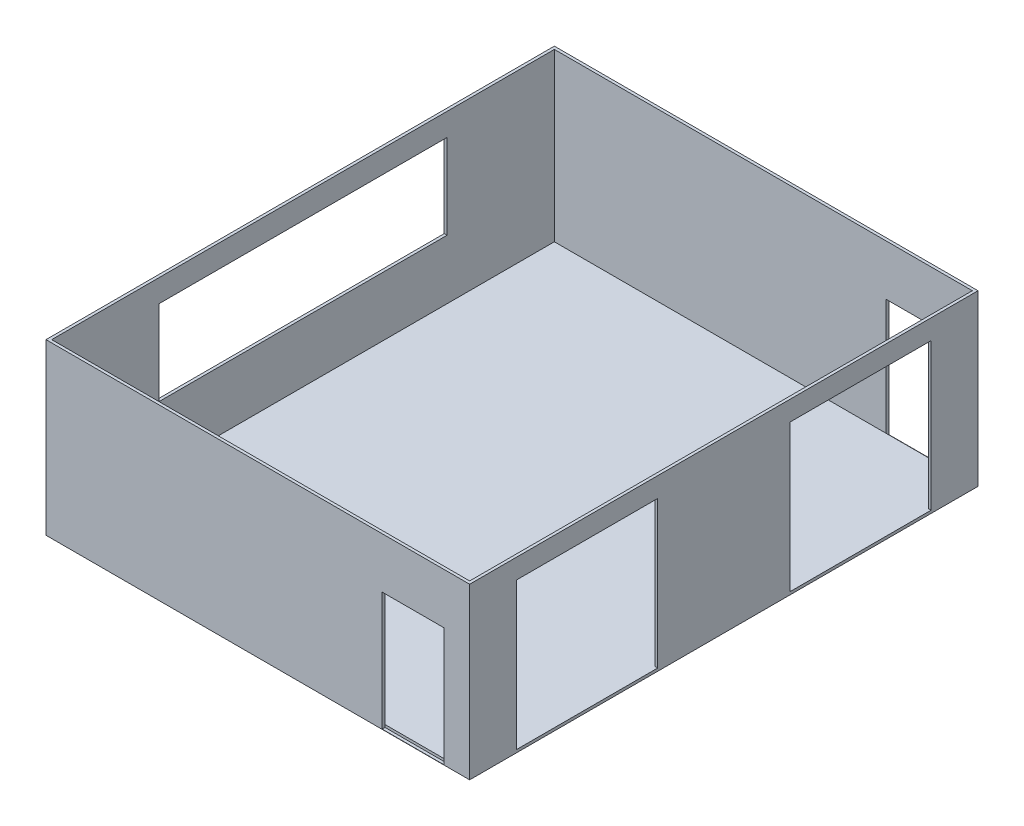
ISO-10303-21;
HEADER;
FILE_DESCRIPTION(('STEP AP214'),'2;1');
FILE_NAME('part.step','',(''),(''),'','','');
FILE_SCHEMA(('AUTOMOTIVE_DESIGN { 1 0 10303 214 1 1 1 1 }'));
ENDSEC;
DATA;
#1=APPLICATION_CONTEXT('core data for automotive mechanical design processes');
#2=APPLICATION_PROTOCOL_DEFINITION('international standard','automotive_design',2000,#1);
#3=PRODUCT_CONTEXT('',#1,'mechanical');
#4=PRODUCT('Part','Part','',(#3));
#5=PRODUCT_RELATED_PRODUCT_CATEGORY('part','',(#4));
#6=PRODUCT_DEFINITION_FORMATION('','',#4);
#7=PRODUCT_DEFINITION_CONTEXT('part definition',#1,'design');
#8=PRODUCT_DEFINITION('design','',#6,#7);
#9=PRODUCT_DEFINITION_SHAPE('','',#8);
#10=(LENGTH_UNIT() NAMED_UNIT(*) SI_UNIT(.MILLI.,.METRE.));
#11=(NAMED_UNIT(*) PLANE_ANGLE_UNIT() SI_UNIT($,.RADIAN.));
#12=(NAMED_UNIT(*) SI_UNIT($,.STERADIAN.) SOLID_ANGLE_UNIT());
#13=UNCERTAINTY_MEASURE_WITH_UNIT(LENGTH_MEASURE(1.E-05),#10,'distance_accuracy_value','');
#14=(GEOMETRIC_REPRESENTATION_CONTEXT(3) GLOBAL_UNCERTAINTY_ASSIGNED_CONTEXT((#13)) GLOBAL_UNIT_ASSIGNED_CONTEXT((#10,
#11,#12)) REPRESENTATION_CONTEXT('',''));
#15=CARTESIAN_POINT('',(0.,0.,0.));
#16=DIRECTION('',(0.,0.,1.));
#17=DIRECTION('',(1.,0.,0.));
#18=AXIS2_PLACEMENT_3D('',#15,#16,#17);
#19=CARTESIAN_POINT('',(-3750.,3000.,4500.));
#20=DIRECTION('',(1.,0.,0.));
#21=DIRECTION('',(0.,0.,-1.));
#22=AXIS2_PLACEMENT_3D('',#19,#20,#21);
#23=PLANE('',#22);
#24=DIRECTION('',(0.,0.,1.));
#25=VECTOR('',#24,1.);
#26=CARTESIAN_POINT('',(-3750.,0.,4500.));
#27=LINE('',#26,#25);
#28=CARTESIAN_POINT('',(-3750.,0.,-4500.));
#29=VERTEX_POINT('',#28);
#30=CARTESIAN_POINT('',(-3750.,0.,4500.));
#31=VERTEX_POINT('',#30);
#32=EDGE_CURVE('E389',#29,#31,#27,.T.);
#33=ORIENTED_EDGE('',*,*,#32,.T.);
#34=DIRECTION('',(0.,-1.,0.));
#35=VECTOR('',#34,1.);
#36=CARTESIAN_POINT('',(-3750.,3000.,4500.));
#37=LINE('',#36,#35);
#38=CARTESIAN_POINT('',(-3750.,3000.,4500.));
#39=VERTEX_POINT('',#38);
#40=EDGE_CURVE('E39',#39,#31,#37,.T.);
#41=ORIENTED_EDGE('',*,*,#40,.F.);
#42=DIRECTION('',(0.,0.,1.));
#43=VECTOR('',#42,1.);
#44=CARTESIAN_POINT('',(-3750.,3000.,4500.));
#45=LINE('',#44,#43);
#46=CARTESIAN_POINT('',(-3750.,3000.,-4500.));
#47=VERTEX_POINT('',#46);
#48=EDGE_CURVE('E422',#47,#39,#45,.T.);
#49=ORIENTED_EDGE('',*,*,#48,.F.);
#50=DIRECTION('',(0.,-1.,0.));
#51=VECTOR('',#50,1.);
#52=CARTESIAN_POINT('',(-3750.,3000.,-4500.));
#53=LINE('',#52,#51);
#54=EDGE_CURVE('E432',#47,#29,#53,.T.);
#55=ORIENTED_EDGE('',*,*,#54,.T.);
#56=EDGE_LOOP('',(#33,#41,#49,#55));
#57=FACE_BOUND('',#56,.T.);
#58=DIRECTION('',(0.,-1.,0.));
#59=VECTOR('',#58,1.);
#60=CARTESIAN_POINT('',(-3750.,0.,2550.));
#61=LINE('',#60,#59);
#62=CARTESIAN_POINT('',(-3750.,2600.,2550.));
#63=VERTEX_POINT('',#62);
#64=CARTESIAN_POINT('',(-3750.,1100.,2550.));
#65=VERTEX_POINT('',#64);
#66=EDGE_CURVE('E46',#63,#65,#61,.T.);
#67=ORIENTED_EDGE('',*,*,#66,.T.);
#68=DIRECTION('',(0.,0.,1.));
#69=VECTOR('',#68,1.);
#70=CARTESIAN_POINT('',(-3750.,1100.,0.));
#71=LINE('',#70,#69);
#72=CARTESIAN_POINT('',(-3750.,1100.,-2550.));
#73=VERTEX_POINT('',#72);
#74=EDGE_CURVE('E244',#73,#65,#71,.T.);
#75=ORIENTED_EDGE('',*,*,#74,.F.);
#76=DIRECTION('',(0.,-1.,0.));
#77=VECTOR('',#76,1.);
#78=CARTESIAN_POINT('',(-3750.,0.,-2550.));
#79=LINE('',#78,#77);
#80=CARTESIAN_POINT('',(-3750.,2600.,-2550.));
#81=VERTEX_POINT('',#80);
#82=EDGE_CURVE('E247',#81,#73,#79,.T.);
#83=ORIENTED_EDGE('',*,*,#82,.F.);
#84=DIRECTION('',(0.,0.,1.));
#85=VECTOR('',#84,1.);
#86=CARTESIAN_POINT('',(-3750.,2600.,0.));
#87=LINE('',#86,#85);
#88=EDGE_CURVE('E253',#81,#63,#87,.T.);
#89=ORIENTED_EDGE('',*,*,#88,.T.);
#90=EDGE_LOOP('',(#67,#75,#83,#89));
#91=FACE_BOUND('',#90,.T.);
#92=ADVANCED_FACE('F32',(#57,#91),#23,.F.);
#93=CARTESIAN_POINT('',(-3700.,3000.,4500.));
#94=DIRECTION('',(1.,0.,0.));
#95=DIRECTION('',(0.,0.,-1.));
#96=AXIS2_PLACEMENT_3D('',#93,#94,#95);
#97=PLANE('',#96);
#98=DIRECTION('',(0.,0.,1.));
#99=VECTOR('',#98,1.);
#100=CARTESIAN_POINT('',(-3700.,49.9999999999998,4500.));
#101=LINE('',#100,#99);
#102=CARTESIAN_POINT('',(-3700.,50.,-4450.));
#103=VERTEX_POINT('',#102);
#104=CARTESIAN_POINT('',(-3700.,50.,4450.));
#105=VERTEX_POINT('',#104);
#106=EDGE_CURVE('E382',#103,#105,#101,.T.);
#107=ORIENTED_EDGE('',*,*,#106,.F.);
#108=DIRECTION('',(0.,-1.,0.));
#109=VECTOR('',#108,1.);
#110=CARTESIAN_POINT('',(-3700.,3000.,-4450.));
#111=LINE('',#110,#109);
#112=CARTESIAN_POINT('',(-3700.,3000.,-4450.));
#113=VERTEX_POINT('',#112);
#114=EDGE_CURVE('E391',#113,#103,#111,.T.);
#115=ORIENTED_EDGE('',*,*,#114,.F.);
#116=DIRECTION('',(0.,0.,1.));
#117=VECTOR('',#116,1.);
#118=CARTESIAN_POINT('',(-3700.,3000.,4500.));
#119=LINE('',#118,#117);
#120=CARTESIAN_POINT('',(-3700.,3000.,4450.));
#121=VERTEX_POINT('',#120);
#122=EDGE_CURVE('E413',#113,#121,#119,.T.);
#123=ORIENTED_EDGE('',*,*,#122,.T.);
#124=DIRECTION('',(0.,-1.,0.));
#125=VECTOR('',#124,1.);
#126=CARTESIAN_POINT('',(-3700.,3000.,4450.));
#127=LINE('',#126,#125);
#128=EDGE_CURVE('E386',#121,#105,#127,.T.);
#129=ORIENTED_EDGE('',*,*,#128,.T.);
#130=EDGE_LOOP('',(#107,#115,#123,#129));
#131=FACE_BOUND('',#130,.T.);
#132=DIRECTION('',(0.,0.,1.));
#133=VECTOR('',#132,1.);
#134=CARTESIAN_POINT('',(-3700.,1100.,0.));
#135=LINE('',#134,#133);
#136=CARTESIAN_POINT('',(-3700.,1100.,-2550.));
#137=VERTEX_POINT('',#136);
#138=CARTESIAN_POINT('',(-3700.,1100.,2550.));
#139=VERTEX_POINT('',#138);
#140=EDGE_CURVE('E239',#137,#139,#135,.T.);
#141=ORIENTED_EDGE('',*,*,#140,.T.);
#142=DIRECTION('',(0.,-1.,0.));
#143=VECTOR('',#142,1.);
#144=CARTESIAN_POINT('',(-3700.,0.,2550.));
#145=LINE('',#144,#143);
#146=CARTESIAN_POINT('',(-3700.,2600.,2550.));
#147=VERTEX_POINT('',#146);
#148=EDGE_CURVE('E235',#147,#139,#145,.T.);
#149=ORIENTED_EDGE('',*,*,#148,.F.);
#150=DIRECTION('',(0.,0.,1.));
#151=VECTOR('',#150,1.);
#152=CARTESIAN_POINT('',(-3700.,2600.,0.));
#153=LINE('',#152,#151);
#154=CARTESIAN_POINT('',(-3700.,2600.,-2550.));
#155=VERTEX_POINT('',#154);
#156=EDGE_CURVE('E227',#155,#147,#153,.T.);
#157=ORIENTED_EDGE('',*,*,#156,.F.);
#158=DIRECTION('',(0.,-1.,0.));
#159=VECTOR('',#158,1.);
#160=CARTESIAN_POINT('',(-3700.,0.,-2550.));
#161=LINE('',#160,#159);
#162=EDGE_CURVE('E54',#155,#137,#161,.T.);
#163=ORIENTED_EDGE('',*,*,#162,.T.);
#164=EDGE_LOOP('',(#141,#149,#157,#163));
#165=FACE_BOUND('',#164,.T.);
#166=ADVANCED_FACE('F242',(#131,#165),#97,.T.);
#167=CARTESIAN_POINT('',(3750.,3000.,4500.));
#168=DIRECTION('',(0.,0.,-1.));
#169=DIRECTION('',(-1.,0.,0.));
#170=AXIS2_PLACEMENT_3D('',#167,#168,#169);
#171=PLANE('',#170);
#172=DIRECTION('',(-1.,0.,0.));
#173=VECTOR('',#172,1.);
#174=CARTESIAN_POINT('',(3300.,2105.,4500.));
#175=LINE('',#174,#173);
#176=CARTESIAN_POINT('',(3300.,2105.,4500.));
#177=VERTEX_POINT('',#176);
#178=CARTESIAN_POINT('',(2200.,2105.,4500.));
#179=VERTEX_POINT('',#178);
#180=EDGE_CURVE('E311',#177,#179,#175,.T.);
#181=ORIENTED_EDGE('',*,*,#180,.F.);
#182=DIRECTION('',(0.,1.,0.));
#183=VECTOR('',#182,1.);
#184=CARTESIAN_POINT('',(3300.,2105.,4500.));
#185=LINE('',#184,#183);
#186=CARTESIAN_POINT('',(3300.,4.99999999999958,4500.));
#187=VERTEX_POINT('',#186);
#188=EDGE_CURVE('E289',#187,#177,#185,.T.);
#189=ORIENTED_EDGE('',*,*,#188,.F.);
#190=DIRECTION('',(1.,0.,0.));
#191=VECTOR('',#190,1.);
#192=CARTESIAN_POINT('',(3300.,4.99999999999958,4500.));
#193=LINE('',#192,#191);
#194=CARTESIAN_POINT('',(2200.,4.99999999999945,4500.));
#195=VERTEX_POINT('',#194);
#196=EDGE_CURVE('E317',#195,#187,#193,.T.);
#197=ORIENTED_EDGE('',*,*,#196,.F.);
#198=DIRECTION('',(0.,-1.,0.));
#199=VECTOR('',#198,1.);
#200=CARTESIAN_POINT('',(2200.,2105.,4500.));
#201=LINE('',#200,#199);
#202=EDGE_CURVE('E314',#179,#195,#201,.T.);
#203=ORIENTED_EDGE('',*,*,#202,.F.);
#204=EDGE_LOOP('',(#181,#189,#197,#203));
#205=FACE_BOUND('',#204,.T.);
#206=DIRECTION('',(1.,0.,0.));
#207=VECTOR('',#206,1.);
#208=CARTESIAN_POINT('',(3750.,0.,4500.));
#209=LINE('',#208,#207);
#210=CARTESIAN_POINT('',(3750.,0.,4500.));
#211=VERTEX_POINT('',#210);
#212=EDGE_CURVE('E435',#31,#211,#209,.T.);
#213=ORIENTED_EDGE('',*,*,#212,.T.);
#214=DIRECTION('',(0.,-1.,0.));
#215=VECTOR('',#214,1.);
#216=CARTESIAN_POINT('',(3750.,3000.,4500.));
#217=LINE('',#216,#215);
#218=CARTESIAN_POINT('',(3750.,3000.,4500.));
#219=VERTEX_POINT('',#218);
#220=EDGE_CURVE('E445',#219,#211,#217,.T.);
#221=ORIENTED_EDGE('',*,*,#220,.F.);
#222=DIRECTION('',(1.,0.,0.));
#223=VECTOR('',#222,1.);
#224=CARTESIAN_POINT('',(3750.,3000.,4500.));
#225=LINE('',#224,#223);
#226=EDGE_CURVE('E425',#39,#219,#225,.T.);
#227=ORIENTED_EDGE('',*,*,#226,.F.);
#228=ORIENTED_EDGE('',*,*,#40,.T.);
#229=EDGE_LOOP('',(#213,#221,#227,#228));
#230=FACE_BOUND('',#229,.T.);
#231=ADVANCED_FACE('F450',(#205,#230),#171,.F.);
#232=CARTESIAN_POINT('',(3750.,3000.,4500.));
#233=DIRECTION('',(-1.,0.,0.));
#234=DIRECTION('',(0.,0.,1.));
#235=AXIS2_PLACEMENT_3D('',#232,#233,#234);
#236=PLANE('',#235);
#237=DIRECTION('',(0.,0.,1.));
#238=VECTOR('',#237,1.);
#239=CARTESIAN_POINT('',(3750.,2650.,1170.));
#240=LINE('',#239,#238);
#241=CARTESIAN_POINT('',(3750.,2650.,1170.));
#242=VERTEX_POINT('',#241);
#243=CARTESIAN_POINT('',(3750.,2650.,3670.));
#244=VERTEX_POINT('',#243);
#245=EDGE_CURVE('E330',#242,#244,#240,.T.);
#246=ORIENTED_EDGE('',*,*,#245,.F.);
#247=DIRECTION('',(0.,1.,0.));
#248=VECTOR('',#247,1.);
#249=CARTESIAN_POINT('',(3750.,2650.,1170.));
#250=LINE('',#249,#248);
#251=CARTESIAN_POINT('',(3750.,50.,1170.));
#252=VERTEX_POINT('',#251);
#253=EDGE_CURVE('E322',#252,#242,#250,.T.);
#254=ORIENTED_EDGE('',*,*,#253,.F.);
#255=DIRECTION('',(0.,0.,-1.));
#256=VECTOR('',#255,1.);
#257=CARTESIAN_POINT('',(3750.,50.,1170.));
#258=LINE('',#257,#256);
#259=CARTESIAN_POINT('',(3750.,49.9999999999994,3670.));
#260=VERTEX_POINT('',#259);
#261=EDGE_CURVE('E336',#260,#252,#258,.T.);
#262=ORIENTED_EDGE('',*,*,#261,.F.);
#263=DIRECTION('',(0.,-1.,0.));
#264=VECTOR('',#263,1.);
#265=CARTESIAN_POINT('',(3750.,2650.,3670.));
#266=LINE('',#265,#264);
#267=EDGE_CURVE('E333',#244,#260,#266,.T.);
#268=ORIENTED_EDGE('',*,*,#267,.F.);
#269=EDGE_LOOP('',(#246,#254,#262,#268));
#270=FACE_BOUND('',#269,.T.);
#271=DIRECTION('',(0.,-1.,0.));
#272=VECTOR('',#271,1.);
#273=CARTESIAN_POINT('',(3750.,2650.,-1170.));
#274=LINE('',#273,#272);
#275=CARTESIAN_POINT('',(3750.,2650.,-1170.));
#276=VERTEX_POINT('',#275);
#277=CARTESIAN_POINT('',(3750.,49.9999999999994,-1170.));
#278=VERTEX_POINT('',#277);
#279=EDGE_CURVE('E365',#276,#278,#274,.T.);
#280=ORIENTED_EDGE('',*,*,#279,.F.);
#281=DIRECTION('',(0.,0.,1.));
#282=VECTOR('',#281,1.);
#283=CARTESIAN_POINT('',(3750.,2650.,-3670.));
#284=LINE('',#283,#282);
#285=CARTESIAN_POINT('',(3750.,2650.,-3670.));
#286=VERTEX_POINT('',#285);
#287=EDGE_CURVE('E362',#286,#276,#284,.T.);
#288=ORIENTED_EDGE('',*,*,#287,.F.);
#289=DIRECTION('',(0.,1.,0.));
#290=VECTOR('',#289,1.);
#291=CARTESIAN_POINT('',(3750.,2650.,-3670.));
#292=LINE('',#291,#290);
#293=CARTESIAN_POINT('',(3750.,49.9999999999998,-3670.));
#294=VERTEX_POINT('',#293);
#295=EDGE_CURVE('E359',#294,#286,#292,.T.);
#296=ORIENTED_EDGE('',*,*,#295,.F.);
#297=DIRECTION('',(0.,0.,-1.));
#298=VECTOR('',#297,1.);
#299=CARTESIAN_POINT('',(3750.,49.9999999999999,-3670.));
#300=LINE('',#299,#298);
#301=EDGE_CURVE('E368',#278,#294,#300,.T.);
#302=ORIENTED_EDGE('',*,*,#301,.F.);
#303=EDGE_LOOP('',(#280,#288,#296,#302));
#304=FACE_BOUND('',#303,.T.);
#305=DIRECTION('',(0.,0.,-1.));
#306=VECTOR('',#305,1.);
#307=CARTESIAN_POINT('',(3750.,0.,4500.));
#308=LINE('',#307,#306);
#309=CARTESIAN_POINT('',(3750.,0.,-4500.));
#310=VERTEX_POINT('',#309);
#311=EDGE_CURVE('E437',#211,#310,#308,.T.);
#312=ORIENTED_EDGE('',*,*,#311,.T.);
#313=DIRECTION('',(0.,-1.,0.));
#314=VECTOR('',#313,1.);
#315=CARTESIAN_POINT('',(3750.,3000.,-4500.));
#316=LINE('',#315,#314);
#317=CARTESIAN_POINT('',(3750.,3000.,-4500.));
#318=VERTEX_POINT('',#317);
#319=EDGE_CURVE('E442',#318,#310,#316,.T.);
#320=ORIENTED_EDGE('',*,*,#319,.F.);
#321=DIRECTION('',(0.,0.,-1.));
#322=VECTOR('',#321,1.);
#323=CARTESIAN_POINT('',(3750.,3000.,4500.));
#324=LINE('',#323,#322);
#325=EDGE_CURVE('E428',#219,#318,#324,.T.);
#326=ORIENTED_EDGE('',*,*,#325,.F.);
#327=ORIENTED_EDGE('',*,*,#220,.T.);
#328=EDGE_LOOP('',(#312,#320,#326,#327));
#329=FACE_BOUND('',#328,.T.);
#330=ADVANCED_FACE('F463',(#270,#304,#329),#236,.F.);
#331=CARTESIAN_POINT('',(3750.,3000.,-4500.));
#332=DIRECTION('',(0.,0.,1.));
#333=DIRECTION('',(1.,0.,0.));
#334=AXIS2_PLACEMENT_3D('',#331,#332,#333);
#335=PLANE('',#334);
#336=DIRECTION('',(-1.,0.,0.));
#337=VECTOR('',#336,1.);
#338=CARTESIAN_POINT('',(3270.,4.99999999999989,-4500.));
#339=LINE('',#338,#337);
#340=CARTESIAN_POINT('',(3270.,4.99999999999989,-4500.));
#341=VERTEX_POINT('',#340);
#342=CARTESIAN_POINT('',(2170.,4.99999999999989,-4500.));
#343=VERTEX_POINT('',#342);
#344=EDGE_CURVE('E278',#341,#343,#339,.T.);
#345=ORIENTED_EDGE('',*,*,#344,.F.);
#346=DIRECTION('',(0.,-1.,0.));
#347=VECTOR('',#346,1.);
#348=CARTESIAN_POINT('',(3270.,4.99999999999989,-4500.));
#349=LINE('',#348,#347);
#350=CARTESIAN_POINT('',(3270.,2105.,-4500.));
#351=VERTEX_POINT('',#350);
#352=EDGE_CURVE('E259',#351,#341,#349,.T.);
#353=ORIENTED_EDGE('',*,*,#352,.F.);
#354=DIRECTION('',(1.,0.,0.));
#355=VECTOR('',#354,1.);
#356=CARTESIAN_POINT('',(3270.,2105.,-4500.));
#357=LINE('',#356,#355);
#358=CARTESIAN_POINT('',(2170.,2105.,-4500.));
#359=VERTEX_POINT('',#358);
#360=EDGE_CURVE('E284',#359,#351,#357,.T.);
#361=ORIENTED_EDGE('',*,*,#360,.F.);
#362=DIRECTION('',(0.,1.,0.));
#363=VECTOR('',#362,1.);
#364=CARTESIAN_POINT('',(2170.,4.99999999999989,-4500.));
#365=LINE('',#364,#363);
#366=EDGE_CURVE('E281',#343,#359,#365,.T.);
#367=ORIENTED_EDGE('',*,*,#366,.F.);
#368=EDGE_LOOP('',(#345,#353,#361,#367));
#369=FACE_BOUND('',#368,.T.);
#370=DIRECTION('',(-1.,0.,0.));
#371=VECTOR('',#370,1.);
#372=CARTESIAN_POINT('',(3750.,0.,-4500.));
#373=LINE('',#372,#371);
#374=EDGE_CURVE('E426',#310,#29,#373,.T.);
#375=ORIENTED_EDGE('',*,*,#374,.T.);
#376=ORIENTED_EDGE('',*,*,#54,.F.);
#377=DIRECTION('',(-1.,0.,0.));
#378=VECTOR('',#377,1.);
#379=CARTESIAN_POINT('',(3750.,3000.,-4500.));
#380=LINE('',#379,#378);
#381=EDGE_CURVE('E430',#318,#47,#380,.T.);
#382=ORIENTED_EDGE('',*,*,#381,.F.);
#383=ORIENTED_EDGE('',*,*,#319,.T.);
#384=EDGE_LOOP('',(#375,#376,#382,#383));
#385=FACE_BOUND('',#384,.T.);
#386=ADVANCED_FACE('F467',(#369,#385),#335,.F.);
#387=CARTESIAN_POINT('',(0.,3000.,0.));
#388=DIRECTION('',(0.,1.,0.));
#389=DIRECTION('',(0.,0.,1.));
#390=AXIS2_PLACEMENT_3D('',#387,#388,#389);
#391=PLANE('',#390);
#392=ORIENTED_EDGE('',*,*,#122,.F.);
#393=DIRECTION('',(-1.,0.,0.));
#394=VECTOR('',#393,1.);
#395=CARTESIAN_POINT('',(3750.,3000.,-4450.));
#396=LINE('',#395,#394);
#397=CARTESIAN_POINT('',(3700.,3000.,-4450.));
#398=VERTEX_POINT('',#397);
#399=EDGE_CURVE('E395',#398,#113,#396,.T.);
#400=ORIENTED_EDGE('',*,*,#399,.F.);
#401=DIRECTION('',(0.,0.,-1.));
#402=VECTOR('',#401,1.);
#403=CARTESIAN_POINT('',(3700.,3000.,4500.));
#404=LINE('',#403,#402);
#405=CARTESIAN_POINT('',(3700.,3000.,4450.));
#406=VERTEX_POINT('',#405);
#407=EDGE_CURVE('E418',#406,#398,#404,.T.);
#408=ORIENTED_EDGE('',*,*,#407,.F.);
#409=DIRECTION('',(1.,0.,0.));
#410=VECTOR('',#409,1.);
#411=CARTESIAN_POINT('',(3750.,3000.,4450.));
#412=LINE('',#411,#410);
#413=EDGE_CURVE('E416',#121,#406,#412,.T.);
#414=ORIENTED_EDGE('',*,*,#413,.F.);
#415=EDGE_LOOP('',(#392,#400,#408,#414));
#416=FACE_BOUND('',#415,.T.);
#417=ORIENTED_EDGE('',*,*,#48,.T.);
#418=ORIENTED_EDGE('',*,*,#226,.T.);
#419=ORIENTED_EDGE('',*,*,#325,.T.);
#420=ORIENTED_EDGE('',*,*,#381,.T.);
#421=EDGE_LOOP('',(#417,#418,#419,#420));
#422=FACE_BOUND('',#421,.T.);
#423=ADVANCED_FACE('F469',(#416,#422),#391,.T.);
#424=CARTESIAN_POINT('',(0.,0.,0.));
#425=DIRECTION('',(0.,1.,0.));
#426=DIRECTION('',(0.,0.,1.));
#427=AXIS2_PLACEMENT_3D('',#424,#425,#426);
#428=PLANE('',#427);
#429=ORIENTED_EDGE('',*,*,#32,.F.);
#430=ORIENTED_EDGE('',*,*,#374,.F.);
#431=ORIENTED_EDGE('',*,*,#311,.F.);
#432=ORIENTED_EDGE('',*,*,#212,.F.);
#433=EDGE_LOOP('',(#429,#430,#431,#432));
#434=FACE_BOUND('',#433,.T.);
#435=ADVANCED_FACE('F459',(#434),#428,.F.);
#436=CARTESIAN_POINT('',(3750.,3000.,4450.));
#437=DIRECTION('',(0.,0.,-1.));
#438=DIRECTION('',(-1.,0.,0.));
#439=AXIS2_PLACEMENT_3D('',#436,#437,#438);
#440=PLANE('',#439);
#441=DIRECTION('',(0.,1.,0.));
#442=VECTOR('',#441,1.);
#443=CARTESIAN_POINT('',(3300.,2105.,4450.));
#444=LINE('',#443,#442);
#445=CARTESIAN_POINT('',(3300.,49.9999999999998,4450.));
#446=VERTEX_POINT('',#445);
#447=CARTESIAN_POINT('',(3300.,2105.,4450.));
#448=VERTEX_POINT('',#447);
#449=EDGE_CURVE('E299',#446,#448,#444,.T.);
#450=ORIENTED_EDGE('',*,*,#449,.T.);
#451=DIRECTION('',(-1.,0.,0.));
#452=VECTOR('',#451,1.);
#453=CARTESIAN_POINT('',(3300.,2105.,4450.));
#454=LINE('',#453,#452);
#455=CARTESIAN_POINT('',(2200.,2105.,4450.));
#456=VERTEX_POINT('',#455);
#457=EDGE_CURVE('E298',#448,#456,#454,.T.);
#458=ORIENTED_EDGE('',*,*,#457,.T.);
#459=DIRECTION('',(0.,-1.,0.));
#460=VECTOR('',#459,1.);
#461=CARTESIAN_POINT('',(2200.,2105.,4450.));
#462=LINE('',#461,#460);
#463=CARTESIAN_POINT('',(2200.,49.9999999999998,4450.));
#464=VERTEX_POINT('',#463);
#465=EDGE_CURVE('E303',#456,#464,#462,.T.);
#466=ORIENTED_EDGE('',*,*,#465,.T.);
#467=DIRECTION('',(1.,0.,0.));
#468=VECTOR('',#467,1.);
#469=CARTESIAN_POINT('',(3750.,49.9999999999998,4450.));
#470=LINE('',#469,#468);
#471=EDGE_CURVE('E396',#105,#464,#470,.T.);
#472=ORIENTED_EDGE('',*,*,#471,.F.);
#473=ORIENTED_EDGE('',*,*,#128,.F.);
#474=ORIENTED_EDGE('',*,*,#413,.T.);
#475=DIRECTION('',(0.,-1.,0.));
#476=VECTOR('',#475,1.);
#477=CARTESIAN_POINT('',(3700.,3000.,4450.));
#478=LINE('',#477,#476);
#479=CARTESIAN_POINT('',(3700.,50.,4450.));
#480=VERTEX_POINT('',#479);
#481=EDGE_CURVE('E390',#406,#480,#478,.T.);
#482=ORIENTED_EDGE('',*,*,#481,.T.);
#483=EDGE_CURVE('E385',#446,#480,#470,.T.);
#484=ORIENTED_EDGE('',*,*,#483,.F.);
#485=EDGE_LOOP('',(#450,#458,#466,#472,#473,#474,#482,#484));
#486=FACE_BOUND('',#485,.T.);
#487=ADVANCED_FACE('F477',(#486),#440,.T.);
#488=CARTESIAN_POINT('',(3700.,3000.,4500.));
#489=DIRECTION('',(-1.,0.,0.));
#490=DIRECTION('',(0.,0.,1.));
#491=AXIS2_PLACEMENT_3D('',#488,#489,#490);
#492=PLANE('',#491);
#493=DIRECTION('',(0.,-1.,0.));
#494=VECTOR('',#493,1.);
#495=CARTESIAN_POINT('',(3700.,3000.,1170.));
#496=LINE('',#495,#494);
#497=CARTESIAN_POINT('',(3700.,2650.,1170.));
#498=VERTEX_POINT('',#497);
#499=CARTESIAN_POINT('',(3700.,50.,1170.));
#500=VERTEX_POINT('',#499);
#501=EDGE_CURVE('E351',#498,#500,#496,.T.);
#502=ORIENTED_EDGE('',*,*,#501,.F.);
#503=DIRECTION('',(0.,0.,-1.));
#504=VECTOR('',#503,1.);
#505=CARTESIAN_POINT('',(3700.,2650.,4500.));
#506=LINE('',#505,#504);
#507=CARTESIAN_POINT('',(3700.,2650.,3670.));
#508=VERTEX_POINT('',#507);
#509=EDGE_CURVE('E11',#508,#498,#506,.T.);
#510=ORIENTED_EDGE('',*,*,#509,.F.);
#511=DIRECTION('',(0.,1.,0.));
#512=VECTOR('',#511,1.);
#513=CARTESIAN_POINT('',(3700.,3000.,3670.));
#514=LINE('',#513,#512);
#515=CARTESIAN_POINT('',(3700.,49.9999999999994,3670.));
#516=VERTEX_POINT('',#515);
#517=EDGE_CURVE('E342',#516,#508,#514,.T.);
#518=ORIENTED_EDGE('',*,*,#517,.F.);
#519=DIRECTION('',(0.,0.,-1.));
#520=VECTOR('',#519,1.);
#521=CARTESIAN_POINT('',(3700.,49.9999999999998,4500.));
#522=LINE('',#521,#520);
#523=EDGE_CURVE('E403',#480,#516,#522,.T.);
#524=ORIENTED_EDGE('',*,*,#523,.F.);
#525=ORIENTED_EDGE('',*,*,#481,.F.);
#526=ORIENTED_EDGE('',*,*,#407,.T.);
#527=DIRECTION('',(0.,-1.,0.));
#528=VECTOR('',#527,1.);
#529=CARTESIAN_POINT('',(3700.,3000.,-4450.));
#530=LINE('',#529,#528);
#531=CARTESIAN_POINT('',(3700.,50.,-4450.));
#532=VERTEX_POINT('',#531);
#533=EDGE_CURVE('E394',#398,#532,#530,.T.);
#534=ORIENTED_EDGE('',*,*,#533,.T.);
#535=CARTESIAN_POINT('',(3700.,49.9999999999998,-3670.));
#536=VERTEX_POINT('',#535);
#537=EDGE_CURVE('E399',#536,#532,#522,.T.);
#538=ORIENTED_EDGE('',*,*,#537,.F.);
#539=DIRECTION('',(0.,1.,0.));
#540=VECTOR('',#539,1.);
#541=CARTESIAN_POINT('',(3700.,2650.,-3670.));
#542=LINE('',#541,#540);
#543=CARTESIAN_POINT('',(3700.,2650.,-3670.));
#544=VERTEX_POINT('',#543);
#545=EDGE_CURVE('E356',#536,#544,#542,.T.);
#546=ORIENTED_EDGE('',*,*,#545,.T.);
#547=DIRECTION('',(0.,0.,1.));
#548=VECTOR('',#547,1.);
#549=CARTESIAN_POINT('',(3700.,2650.,-3670.));
#550=LINE('',#549,#548);
#551=CARTESIAN_POINT('',(3700.,2650.,-1170.));
#552=VERTEX_POINT('',#551);
#553=EDGE_CURVE('E374',#544,#552,#550,.T.);
#554=ORIENTED_EDGE('',*,*,#553,.T.);
#555=DIRECTION('',(0.,-1.,0.));
#556=VECTOR('',#555,1.);
#557=CARTESIAN_POINT('',(3700.,2650.,-1170.));
#558=LINE('',#557,#556);
#559=CARTESIAN_POINT('',(3700.,49.9999999999998,-1170.));
#560=VERTEX_POINT('',#559);
#561=EDGE_CURVE('E353',#552,#560,#558,.T.);
#562=ORIENTED_EDGE('',*,*,#561,.T.);
#563=EDGE_CURVE('E407',#500,#560,#522,.T.);
#564=ORIENTED_EDGE('',*,*,#563,.F.);
#565=EDGE_LOOP('',(#502,#510,#518,#524,#525,#526,#534,#538,#546,#554,#562,#564));
#566=FACE_BOUND('',#565,.T.);
#567=ADVANCED_FACE('F500',(#566),#492,.T.);
#568=CARTESIAN_POINT('',(3750.,3000.,-4450.));
#569=DIRECTION('',(0.,0.,1.));
#570=DIRECTION('',(1.,0.,0.));
#571=AXIS2_PLACEMENT_3D('',#568,#569,#570);
#572=PLANE('',#571);
#573=DIRECTION('',(0.,-1.,0.));
#574=VECTOR('',#573,1.);
#575=CARTESIAN_POINT('',(3270.,4.99999999999989,-4450.));
#576=LINE('',#575,#574);
#577=CARTESIAN_POINT('',(3270.,2105.,-4450.));
#578=VERTEX_POINT('',#577);
#579=CARTESIAN_POINT('',(3270.,50.,-4450.));
#580=VERTEX_POINT('',#579);
#581=EDGE_CURVE('E263',#578,#580,#576,.T.);
#582=ORIENTED_EDGE('',*,*,#581,.T.);
#583=DIRECTION('',(-1.,0.,0.));
#584=VECTOR('',#583,1.);
#585=CARTESIAN_POINT('',(3750.,49.9999999999998,-4450.));
#586=LINE('',#585,#584);
#587=EDGE_CURVE('E410',#532,#580,#586,.T.);
#588=ORIENTED_EDGE('',*,*,#587,.F.);
#589=ORIENTED_EDGE('',*,*,#533,.F.);
#590=ORIENTED_EDGE('',*,*,#399,.T.);
#591=ORIENTED_EDGE('',*,*,#114,.T.);
#592=CARTESIAN_POINT('',(2170.,49.9999999999998,-4450.));
#593=VERTEX_POINT('',#592);
#594=EDGE_CURVE('E406',#593,#103,#586,.T.);
#595=ORIENTED_EDGE('',*,*,#594,.F.);
#596=DIRECTION('',(0.,1.,0.));
#597=VECTOR('',#596,1.);
#598=CARTESIAN_POINT('',(2170.,4.99999999999989,-4450.));
#599=LINE('',#598,#597);
#600=CARTESIAN_POINT('',(2170.,2105.,-4450.));
#601=VERTEX_POINT('',#600);
#602=EDGE_CURVE('E270',#593,#601,#599,.T.);
#603=ORIENTED_EDGE('',*,*,#602,.T.);
#604=DIRECTION('',(1.,0.,0.));
#605=VECTOR('',#604,1.);
#606=CARTESIAN_POINT('',(3270.,2105.,-4450.));
#607=LINE('',#606,#605);
#608=EDGE_CURVE('E273',#601,#578,#607,.T.);
#609=ORIENTED_EDGE('',*,*,#608,.T.);
#610=EDGE_LOOP('',(#582,#588,#589,#590,#591,#595,#603,#609));
#611=FACE_BOUND('',#610,.T.);
#612=ADVANCED_FACE('F504',(#611),#572,.T.);
#613=CARTESIAN_POINT('',(0.,50.,0.));
#614=DIRECTION('',(0.,1.,0.));
#615=DIRECTION('',(0.,0.,1.));
#616=AXIS2_PLACEMENT_3D('',#613,#614,#615);
#617=PLANE('',#616);
#618=ORIENTED_EDGE('',*,*,#523,.T.);
#619=DIRECTION('',(1.,0.,0.));
#620=VECTOR('',#619,1.);
#621=CARTESIAN_POINT('',(750.000000000001,49.9999999999994,3670.));
#622=LINE('',#621,#620);
#623=EDGE_CURVE('E343',#516,#260,#622,.T.);
#624=ORIENTED_EDGE('',*,*,#623,.T.);
#625=ORIENTED_EDGE('',*,*,#261,.T.);
#626=DIRECTION('',(1.,0.,0.));
#627=VECTOR('',#626,1.);
#628=CARTESIAN_POINT('',(750.,50.,1170.));
#629=LINE('',#628,#627);
#630=EDGE_CURVE('E340',#500,#252,#629,.T.);
#631=ORIENTED_EDGE('',*,*,#630,.F.);
#632=ORIENTED_EDGE('',*,*,#563,.T.);
#633=DIRECTION('',(1.,0.,0.));
#634=VECTOR('',#633,1.);
#635=CARTESIAN_POINT('',(-3750.001,49.9999999999994,-1170.));
#636=LINE('',#635,#634);
#637=EDGE_CURVE('E375',#560,#278,#636,.T.);
#638=ORIENTED_EDGE('',*,*,#637,.T.);
#639=ORIENTED_EDGE('',*,*,#301,.T.);
#640=DIRECTION('',(1.,0.,0.));
#641=VECTOR('',#640,1.);
#642=CARTESIAN_POINT('',(-3750.001,49.9999999999999,-3670.));
#643=LINE('',#642,#641);
#644=EDGE_CURVE('E371',#536,#294,#643,.T.);
#645=ORIENTED_EDGE('',*,*,#644,.F.);
#646=ORIENTED_EDGE('',*,*,#537,.T.);
#647=ORIENTED_EDGE('',*,*,#587,.T.);
#648=EDGE_CURVE('E414',#580,#593,#586,.T.);
#649=ORIENTED_EDGE('',*,*,#648,.T.);
#650=ORIENTED_EDGE('',*,*,#594,.T.);
#651=ORIENTED_EDGE('',*,*,#106,.T.);
#652=ORIENTED_EDGE('',*,*,#471,.T.);
#653=EDGE_CURVE('E400',#464,#446,#470,.T.);
#654=ORIENTED_EDGE('',*,*,#653,.T.);
#655=ORIENTED_EDGE('',*,*,#483,.T.);
#656=EDGE_LOOP('',(#618,#624,#625,#631,#632,#638,#639,#645,#646,#647,#649,#650,#651,#652,#654,#655));
#657=FACE_BOUND('',#656,.T.);
#658=ADVANCED_FACE('F507',(#657),#617,.T.);
#659=CARTESIAN_POINT('',(-3750.001,2650.,-3670.));
#660=DIRECTION('',(0.,1.,0.));
#661=DIRECTION('',(0.,0.,1.));
#662=AXIS2_PLACEMENT_3D('',#659,#660,#661);
#663=PLANE('',#662);
#664=DIRECTION('',(1.,0.,0.));
#665=VECTOR('',#664,1.);
#666=CARTESIAN_POINT('',(-3750.001,2650.,-3670.));
#667=LINE('',#666,#665);
#668=EDGE_CURVE('E370',#544,#286,#667,.T.);
#669=ORIENTED_EDGE('',*,*,#668,.T.);
#670=ORIENTED_EDGE('',*,*,#287,.T.);
#671=DIRECTION('',(1.,0.,0.));
#672=VECTOR('',#671,1.);
#673=CARTESIAN_POINT('',(-3750.001,2650.,-1170.));
#674=LINE('',#673,#672);
#675=EDGE_CURVE('E377',#552,#276,#674,.T.);
#676=ORIENTED_EDGE('',*,*,#675,.F.);
#677=ORIENTED_EDGE('',*,*,#553,.F.);
#678=EDGE_LOOP('',(#669,#670,#676,#677));
#679=FACE_BOUND('',#678,.T.);
#680=ADVANCED_FACE('F510',(#679),#663,.F.);
#681=CARTESIAN_POINT('',(-3750.001,2650.,-1170.));
#682=DIRECTION('',(0.,0.,1.));
#683=DIRECTION('',(0.,-1.,0.));
#684=AXIS2_PLACEMENT_3D('',#681,#682,#683);
#685=PLANE('',#684);
#686=ORIENTED_EDGE('',*,*,#675,.T.);
#687=ORIENTED_EDGE('',*,*,#279,.T.);
#688=ORIENTED_EDGE('',*,*,#637,.F.);
#689=ORIENTED_EDGE('',*,*,#561,.F.);
#690=EDGE_LOOP('',(#686,#687,#688,#689));
#691=FACE_BOUND('',#690,.T.);
#692=ADVANCED_FACE('F515',(#691),#685,.F.);
#693=CARTESIAN_POINT('',(-3750.001,2650.,-3670.));
#694=DIRECTION('',(0.,0.,-1.));
#695=DIRECTION('',(-1.,0.,0.));
#696=AXIS2_PLACEMENT_3D('',#693,#694,#695);
#697=PLANE('',#696);
#698=ORIENTED_EDGE('',*,*,#644,.T.);
#699=ORIENTED_EDGE('',*,*,#295,.T.);
#700=ORIENTED_EDGE('',*,*,#668,.F.);
#701=ORIENTED_EDGE('',*,*,#545,.F.);
#702=EDGE_LOOP('',(#698,#699,#700,#701));
#703=FACE_BOUND('',#702,.T.);
#704=ADVANCED_FACE('F496',(#703),#697,.F.);
#705=CARTESIAN_POINT('',(750.,2650.,1170.));
#706=DIRECTION('',(0.,0.,-1.));
#707=DIRECTION('',(0.,1.,0.));
#708=AXIS2_PLACEMENT_3D('',#705,#706,#707);
#709=PLANE('',#708);
#710=ORIENTED_EDGE('',*,*,#501,.T.);
#711=ORIENTED_EDGE('',*,*,#630,.T.);
#712=ORIENTED_EDGE('',*,*,#253,.T.);
#713=DIRECTION('',(1.,0.,0.));
#714=VECTOR('',#713,1.);
#715=CARTESIAN_POINT('',(750.,2650.,1170.));
#716=LINE('',#715,#714);
#717=EDGE_CURVE('E339',#498,#242,#716,.T.);
#718=ORIENTED_EDGE('',*,*,#717,.F.);
#719=EDGE_LOOP('',(#710,#711,#712,#718));
#720=FACE_BOUND('',#719,.T.);
#721=ADVANCED_FACE('F595',(#720),#709,.F.);
#722=CARTESIAN_POINT('',(750.000000000001,2650.,3670.));
#723=DIRECTION('',(0.,0.,1.));
#724=DIRECTION('',(1.,0.,0.));
#725=AXIS2_PLACEMENT_3D('',#722,#723,#724);
#726=PLANE('',#725);
#727=ORIENTED_EDGE('',*,*,#517,.T.);
#728=DIRECTION('',(1.,0.,0.));
#729=VECTOR('',#728,1.);
#730=CARTESIAN_POINT('',(750.000000000001,2650.,3670.));
#731=LINE('',#730,#729);
#732=EDGE_CURVE('E345',#508,#244,#731,.T.);
#733=ORIENTED_EDGE('',*,*,#732,.T.);
#734=ORIENTED_EDGE('',*,*,#267,.T.);
#735=ORIENTED_EDGE('',*,*,#623,.F.);
#736=EDGE_LOOP('',(#727,#733,#734,#735));
#737=FACE_BOUND('',#736,.T.);
#738=ADVANCED_FACE('F526',(#737),#726,.F.);
#739=CARTESIAN_POINT('',(750.,2650.,1170.));
#740=DIRECTION('',(0.,1.,0.));
#741=DIRECTION('',(0.,0.,1.));
#742=AXIS2_PLACEMENT_3D('',#739,#740,#741);
#743=PLANE('',#742);
#744=ORIENTED_EDGE('',*,*,#509,.T.);
#745=ORIENTED_EDGE('',*,*,#717,.T.);
#746=ORIENTED_EDGE('',*,*,#245,.T.);
#747=ORIENTED_EDGE('',*,*,#732,.F.);
#748=EDGE_LOOP('',(#744,#745,#746,#747));
#749=FACE_BOUND('',#748,.T.);
#750=ADVANCED_FACE('F592',(#749),#743,.F.);
#751=CARTESIAN_POINT('',(3300.,2105.,4450.));
#752=DIRECTION('',(1.,0.,0.));
#753=DIRECTION('',(0.,1.,0.));
#754=AXIS2_PLACEMENT_3D('',#751,#752,#753);
#755=PLANE('',#754);
#756=ORIENTED_EDGE('',*,*,#188,.T.);
#757=DIRECTION('',(0.,0.,1.));
#758=VECTOR('',#757,1.);
#759=CARTESIAN_POINT('',(3300.,2105.,4450.));
#760=LINE('',#759,#758);
#761=EDGE_CURVE('E309',#448,#177,#760,.T.);
#762=ORIENTED_EDGE('',*,*,#761,.F.);
#763=ORIENTED_EDGE('',*,*,#449,.F.);
#764=CARTESIAN_POINT('',(3300.,4.99999999999958,4450.));
#765=VERTEX_POINT('',#764);
#766=EDGE_CURVE('E296',#765,#446,#444,.T.);
#767=ORIENTED_EDGE('',*,*,#766,.F.);
#768=DIRECTION('',(0.,0.,1.));
#769=VECTOR('',#768,1.);
#770=CARTESIAN_POINT('',(3300.,4.99999999999958,4450.));
#771=LINE('',#770,#769);
#772=EDGE_CURVE('E320',#765,#187,#771,.T.);
#773=ORIENTED_EDGE('',*,*,#772,.T.);
#774=EDGE_LOOP('',(#756,#762,#763,#767,#773));
#775=FACE_BOUND('',#774,.T.);
#776=ADVANCED_FACE('F575',(#775),#755,.F.);
#777=CARTESIAN_POINT('',(3300.,4.99999999999958,4450.));
#778=DIRECTION('',(0.,-1.,0.));
#779=DIRECTION('',(1.,0.,0.));
#780=AXIS2_PLACEMENT_3D('',#777,#778,#779);
#781=PLANE('',#780);
#782=ORIENTED_EDGE('',*,*,#196,.T.);
#783=ORIENTED_EDGE('',*,*,#772,.F.);
#784=DIRECTION('',(1.,0.,0.));
#785=VECTOR('',#784,1.);
#786=CARTESIAN_POINT('',(3300.,4.99999999999958,4450.));
#787=LINE('',#786,#785);
#788=CARTESIAN_POINT('',(2200.,4.99999999999945,4450.));
#789=VERTEX_POINT('',#788);
#790=EDGE_CURVE('E306',#789,#765,#787,.T.);
#791=ORIENTED_EDGE('',*,*,#790,.F.);
#792=DIRECTION('',(0.,0.,1.));
#793=VECTOR('',#792,1.);
#794=CARTESIAN_POINT('',(2200.,4.99999999999945,4450.));
#795=LINE('',#794,#793);
#796=EDGE_CURVE('E323',#789,#195,#795,.T.);
#797=ORIENTED_EDGE('',*,*,#796,.T.);
#798=EDGE_LOOP('',(#782,#783,#791,#797));
#799=FACE_BOUND('',#798,.T.);
#800=ADVANCED_FACE('F572',(#799),#781,.F.);
#801=CARTESIAN_POINT('',(2200.,2105.,4450.));
#802=DIRECTION('',(-1.,0.,0.));
#803=DIRECTION('',(0.,0.,1.));
#804=AXIS2_PLACEMENT_3D('',#801,#802,#803);
#805=PLANE('',#804);
#806=ORIENTED_EDGE('',*,*,#202,.T.);
#807=ORIENTED_EDGE('',*,*,#796,.F.);
#808=EDGE_CURVE('E302',#464,#789,#462,.T.);
#809=ORIENTED_EDGE('',*,*,#808,.F.);
#810=ORIENTED_EDGE('',*,*,#465,.F.);
#811=DIRECTION('',(0.,0.,1.));
#812=VECTOR('',#811,1.);
#813=CARTESIAN_POINT('',(2200.,2105.,4450.));
#814=LINE('',#813,#812);
#815=EDGE_CURVE('E325',#456,#179,#814,.T.);
#816=ORIENTED_EDGE('',*,*,#815,.T.);
#817=EDGE_LOOP('',(#806,#807,#809,#810,#816));
#818=FACE_BOUND('',#817,.T.);
#819=ADVANCED_FACE('F567',(#818),#805,.F.);
#820=CARTESIAN_POINT('',(3300.,2105.,4450.));
#821=DIRECTION('',(0.,1.,0.));
#822=DIRECTION('',(-1.,0.,0.));
#823=AXIS2_PLACEMENT_3D('',#820,#821,#822);
#824=PLANE('',#823);
#825=ORIENTED_EDGE('',*,*,#180,.T.);
#826=ORIENTED_EDGE('',*,*,#815,.F.);
#827=ORIENTED_EDGE('',*,*,#457,.F.);
#828=ORIENTED_EDGE('',*,*,#761,.T.);
#829=EDGE_LOOP('',(#825,#826,#827,#828));
#830=FACE_BOUND('',#829,.T.);
#831=ADVANCED_FACE('F578',(#830),#824,.F.);
#832=CARTESIAN_POINT('',(0.,0.,4450.));
#833=DIRECTION('',(0.,0.,-1.));
#834=DIRECTION('',(-1.,0.,0.));
#835=AXIS2_PLACEMENT_3D('',#832,#833,#834);
#836=PLANE('',#835);
#837=ORIENTED_EDGE('',*,*,#653,.F.);
#838=ORIENTED_EDGE('',*,*,#808,.T.);
#839=ORIENTED_EDGE('',*,*,#790,.T.);
#840=ORIENTED_EDGE('',*,*,#766,.T.);
#841=EDGE_LOOP('',(#837,#838,#839,#840));
#842=FACE_BOUND('',#841,.T.);
#843=ADVANCED_FACE('F562',(#842),#836,.F.);
#844=CARTESIAN_POINT('',(3270.,4.99999999999989,-4450.));
#845=DIRECTION('',(1.,0.,0.));
#846=DIRECTION('',(0.,0.,-1.));
#847=AXIS2_PLACEMENT_3D('',#844,#845,#846);
#848=PLANE('',#847);
#849=ORIENTED_EDGE('',*,*,#352,.T.);
#850=DIRECTION('',(0.,0.,-1.));
#851=VECTOR('',#850,1.);
#852=CARTESIAN_POINT('',(3270.,4.99999999999989,-4450.));
#853=LINE('',#852,#851);
#854=CARTESIAN_POINT('',(3270.,4.99999999999989,-4450.));
#855=VERTEX_POINT('',#854);
#856=EDGE_CURVE('E276',#855,#341,#853,.T.);
#857=ORIENTED_EDGE('',*,*,#856,.F.);
#858=EDGE_CURVE('E267',#580,#855,#576,.T.);
#859=ORIENTED_EDGE('',*,*,#858,.F.);
#860=ORIENTED_EDGE('',*,*,#581,.F.);
#861=DIRECTION('',(0.,0.,-1.));
#862=VECTOR('',#861,1.);
#863=CARTESIAN_POINT('',(3270.,2105.,-4450.));
#864=LINE('',#863,#862);
#865=EDGE_CURVE('E287',#578,#351,#864,.T.);
#866=ORIENTED_EDGE('',*,*,#865,.T.);
#867=EDGE_LOOP('',(#849,#857,#859,#860,#866));
#868=FACE_BOUND('',#867,.T.);
#869=ADVANCED_FACE('F547',(#868),#848,.F.);
#870=CARTESIAN_POINT('',(3270.,2105.,-4450.));
#871=DIRECTION('',(0.,1.,0.));
#872=DIRECTION('',(0.,0.,1.));
#873=AXIS2_PLACEMENT_3D('',#870,#871,#872);
#874=PLANE('',#873);
#875=ORIENTED_EDGE('',*,*,#360,.T.);
#876=ORIENTED_EDGE('',*,*,#865,.F.);
#877=ORIENTED_EDGE('',*,*,#608,.F.);
#878=DIRECTION('',(0.,0.,-1.));
#879=VECTOR('',#878,1.);
#880=CARTESIAN_POINT('',(2170.,2105.,-4450.));
#881=LINE('',#880,#879);
#882=EDGE_CURVE('E290',#601,#359,#881,.T.);
#883=ORIENTED_EDGE('',*,*,#882,.T.);
#884=EDGE_LOOP('',(#875,#876,#877,#883));
#885=FACE_BOUND('',#884,.T.);
#886=ADVANCED_FACE('F653',(#885),#874,.F.);
#887=CARTESIAN_POINT('',(2170.,4.99999999999989,-4450.));
#888=DIRECTION('',(-1.,0.,0.));
#889=DIRECTION('',(0.,0.,1.));
#890=AXIS2_PLACEMENT_3D('',#887,#888,#889);
#891=PLANE('',#890);
#892=ORIENTED_EDGE('',*,*,#366,.T.);
#893=ORIENTED_EDGE('',*,*,#882,.F.);
#894=ORIENTED_EDGE('',*,*,#602,.F.);
#895=CARTESIAN_POINT('',(2170.,4.99999999999989,-4450.));
#896=VERTEX_POINT('',#895);
#897=EDGE_CURVE('E271',#896,#593,#599,.T.);
#898=ORIENTED_EDGE('',*,*,#897,.F.);
#899=DIRECTION('',(0.,0.,-1.));
#900=VECTOR('',#899,1.);
#901=CARTESIAN_POINT('',(2170.,4.99999999999989,-4450.));
#902=LINE('',#901,#900);
#903=EDGE_CURVE('E292',#896,#343,#902,.T.);
#904=ORIENTED_EDGE('',*,*,#903,.T.);
#905=EDGE_LOOP('',(#892,#893,#894,#898,#904));
#906=FACE_BOUND('',#905,.T.);
#907=ADVANCED_FACE('F662',(#906),#891,.F.);
#908=CARTESIAN_POINT('',(3270.,4.99999999999989,-4450.));
#909=DIRECTION('',(0.,-1.,0.));
#910=DIRECTION('',(0.,0.,-1.));
#911=AXIS2_PLACEMENT_3D('',#908,#909,#910);
#912=PLANE('',#911);
#913=ORIENTED_EDGE('',*,*,#344,.T.);
#914=ORIENTED_EDGE('',*,*,#903,.F.);
#915=DIRECTION('',(-1.,0.,0.));
#916=VECTOR('',#915,1.);
#917=CARTESIAN_POINT('',(3270.,4.99999999999989,-4450.));
#918=LINE('',#917,#916);
#919=EDGE_CURVE('E266',#855,#896,#918,.T.);
#920=ORIENTED_EDGE('',*,*,#919,.F.);
#921=ORIENTED_EDGE('',*,*,#856,.T.);
#922=EDGE_LOOP('',(#913,#914,#920,#921));
#923=FACE_BOUND('',#922,.T.);
#924=ADVANCED_FACE('F672',(#923),#912,.F.);
#925=CARTESIAN_POINT('',(0.,0.,-4450.));
#926=DIRECTION('',(0.,0.,1.));
#927=DIRECTION('',(1.,0.,0.));
#928=AXIS2_PLACEMENT_3D('',#925,#926,#927);
#929=PLANE('',#928);
#930=ORIENTED_EDGE('',*,*,#648,.F.);
#931=ORIENTED_EDGE('',*,*,#858,.T.);
#932=ORIENTED_EDGE('',*,*,#919,.T.);
#933=ORIENTED_EDGE('',*,*,#897,.T.);
#934=EDGE_LOOP('',(#930,#931,#932,#933));
#935=FACE_BOUND('',#934,.T.);
#936=ADVANCED_FACE('F551',(#935),#929,.F.);
#937=CARTESIAN_POINT('',(-3700.,0.,2550.));
#938=DIRECTION('',(0.,0.,-1.));
#939=DIRECTION('',(-1.,0.,0.));
#940=AXIS2_PLACEMENT_3D('',#937,#938,#939);
#941=PLANE('',#940);
#942=ORIENTED_EDGE('',*,*,#66,.F.);
#943=DIRECTION('',(-1.,0.,0.));
#944=VECTOR('',#943,1.);
#945=CARTESIAN_POINT('',(-3700.,2600.,2550.));
#946=LINE('',#945,#944);
#947=EDGE_CURVE('E230',#147,#63,#946,.T.);
#948=ORIENTED_EDGE('',*,*,#947,.F.);
#949=ORIENTED_EDGE('',*,*,#148,.T.);
#950=DIRECTION('',(-1.,0.,0.));
#951=VECTOR('',#950,1.);
#952=CARTESIAN_POINT('',(-3700.,1100.,2550.));
#953=LINE('',#952,#951);
#954=EDGE_CURVE('E257',#139,#65,#953,.T.);
#955=ORIENTED_EDGE('',*,*,#954,.T.);
#956=EDGE_LOOP('',(#942,#948,#949,#955));
#957=FACE_BOUND('',#956,.T.);
#958=ADVANCED_FACE('F237',(#957),#941,.T.);
#959=CARTESIAN_POINT('',(-3700.,1100.,0.));
#960=DIRECTION('',(0.,-1.,0.));
#961=DIRECTION('',(0.,0.,-1.));
#962=AXIS2_PLACEMENT_3D('',#959,#960,#961);
#963=PLANE('',#962);
#964=ORIENTED_EDGE('',*,*,#74,.T.);
#965=ORIENTED_EDGE('',*,*,#954,.F.);
#966=ORIENTED_EDGE('',*,*,#140,.F.);
#967=DIRECTION('',(-1.,0.,0.));
#968=VECTOR('',#967,1.);
#969=CARTESIAN_POINT('',(-3700.,1100.,-2550.));
#970=LINE('',#969,#968);
#971=EDGE_CURVE('E260',#137,#73,#970,.T.);
#972=ORIENTED_EDGE('',*,*,#971,.T.);
#973=EDGE_LOOP('',(#964,#965,#966,#972));
#974=FACE_BOUND('',#973,.T.);
#975=ADVANCED_FACE('F708',(#974),#963,.F.);
#976=CARTESIAN_POINT('',(-3700.,0.,-2550.));
#977=DIRECTION('',(0.,0.,-1.));
#978=DIRECTION('',(-1.,0.,0.));
#979=AXIS2_PLACEMENT_3D('',#976,#977,#978);
#980=PLANE('',#979);
#981=ORIENTED_EDGE('',*,*,#82,.T.);
#982=ORIENTED_EDGE('',*,*,#971,.F.);
#983=ORIENTED_EDGE('',*,*,#162,.F.);
#984=DIRECTION('',(-1.,0.,0.));
#985=VECTOR('',#984,1.);
#986=CARTESIAN_POINT('',(-3700.,2600.,-2550.));
#987=LINE('',#986,#985);
#988=EDGE_CURVE('E232',#155,#81,#987,.T.);
#989=ORIENTED_EDGE('',*,*,#988,.T.);
#990=EDGE_LOOP('',(#981,#982,#983,#989));
#991=FACE_BOUND('',#990,.T.);
#992=ADVANCED_FACE('F717',(#991),#980,.F.);
#993=CARTESIAN_POINT('',(-3700.,2600.,0.));
#994=DIRECTION('',(0.,-1.,0.));
#995=DIRECTION('',(0.,0.,-1.));
#996=AXIS2_PLACEMENT_3D('',#993,#994,#995);
#997=PLANE('',#996);
#998=ORIENTED_EDGE('',*,*,#88,.F.);
#999=ORIENTED_EDGE('',*,*,#988,.F.);
#1000=ORIENTED_EDGE('',*,*,#156,.T.);
#1001=ORIENTED_EDGE('',*,*,#947,.T.);
#1002=EDGE_LOOP('',(#998,#999,#1000,#1001));
#1003=FACE_BOUND('',#1002,.T.);
#1004=ADVANCED_FACE('F229',(#1003),#997,.T.);
#1005=CLOSED_SHELL('',(#92,#166,#231,#330,#386,#423,#435,#487,#567,#612,#658,#680,#692,#704,
#721,#738,#750,#776,#800,#819,#831,#843,#869,#886,#907,#924,#936,#958,#975,#992,#1004));
#1006=MANIFOLD_SOLID_BREP('B2',#1005);
#1007=ADVANCED_BREP_SHAPE_REPRESENTATION('',(#18,#1006),#14);
#1008=SHAPE_DEFINITION_REPRESENTATION(#9,#1007);
ENDSEC;
END-ISO-10303-21;
